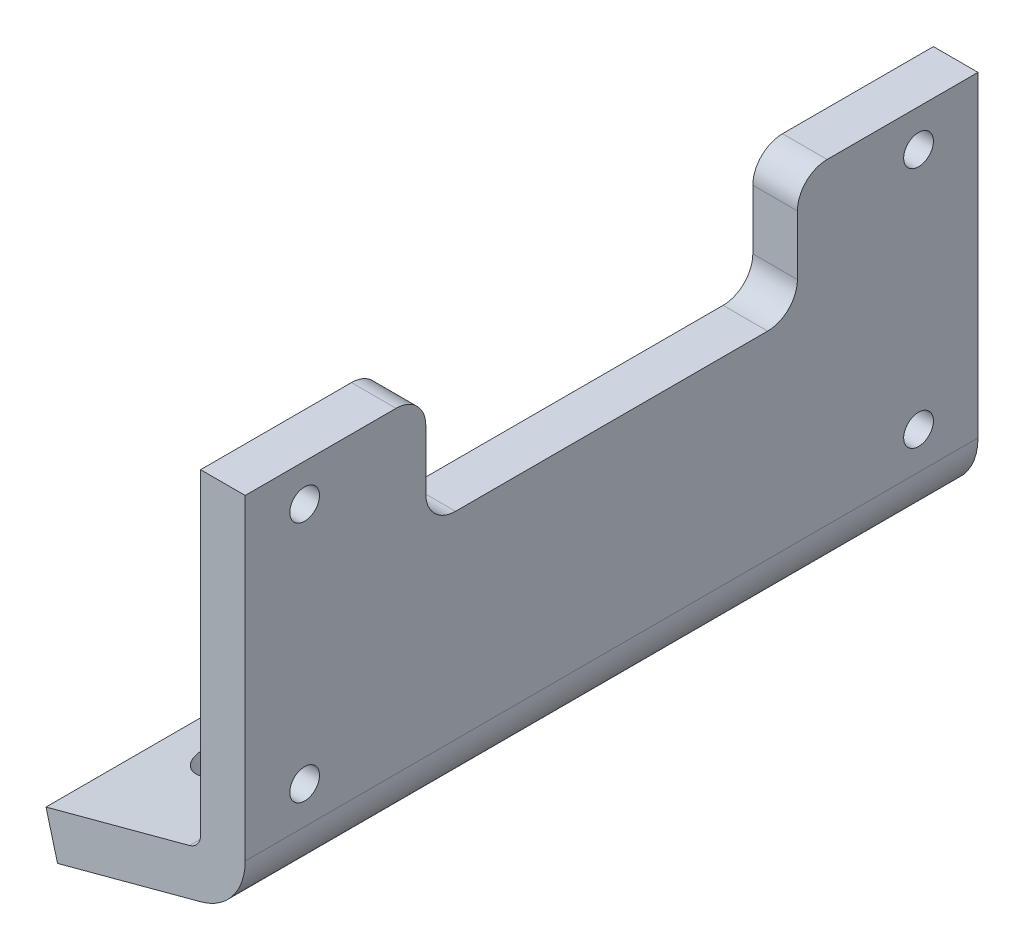
ISO-10303-21;
HEADER;
FILE_DESCRIPTION(('STEP AP214'),'2;1');
FILE_NAME('part.step','',(''),(''),'','','');
FILE_SCHEMA(('AUTOMOTIVE_DESIGN { 1 0 10303 214 1 1 1 1 }'));
ENDSEC;
DATA;
#1=APPLICATION_CONTEXT('core data for automotive mechanical design processes');
#2=APPLICATION_PROTOCOL_DEFINITION('international standard','automotive_design',2000,#1);
#3=PRODUCT_CONTEXT('',#1,'mechanical');
#4=PRODUCT('Part','Part','',(#3));
#5=PRODUCT_RELATED_PRODUCT_CATEGORY('part','',(#4));
#6=PRODUCT_DEFINITION_FORMATION('','',#4);
#7=PRODUCT_DEFINITION_CONTEXT('part definition',#1,'design');
#8=PRODUCT_DEFINITION('design','',#6,#7);
#9=PRODUCT_DEFINITION_SHAPE('','',#8);
#10=(LENGTH_UNIT() NAMED_UNIT(*) SI_UNIT(.MILLI.,.METRE.));
#11=(NAMED_UNIT(*) PLANE_ANGLE_UNIT() SI_UNIT($,.RADIAN.));
#12=(NAMED_UNIT(*) SI_UNIT($,.STERADIAN.) SOLID_ANGLE_UNIT());
#13=UNCERTAINTY_MEASURE_WITH_UNIT(LENGTH_MEASURE(1.E-05),#10,'distance_accuracy_value','');
#14=(GEOMETRIC_REPRESENTATION_CONTEXT(3) GLOBAL_UNCERTAINTY_ASSIGNED_CONTEXT((#13)) GLOBAL_UNIT_ASSIGNED_CONTEXT((#10,
#11,#12)) REPRESENTATION_CONTEXT('',''));
#15=CARTESIAN_POINT('',(0.,0.,0.));
#16=DIRECTION('',(0.,0.,1.));
#17=DIRECTION('',(1.,0.,0.));
#18=AXIS2_PLACEMENT_3D('',#15,#16,#17);
#19=CARTESIAN_POINT('',(-1.5,20.3,49.3));
#20=DIRECTION('',(0.,-1.,0.));
#21=DIRECTION('',(0.,0.,-1.));
#22=AXIS2_PLACEMENT_3D('',#19,#20,#21);
#23=PLANE('',#22);
#24=DIRECTION('',(0.,0.,-1.));
#25=VECTOR('',#24,1.);
#26=CARTESIAN_POINT('',(1.5,20.3,49.3));
#27=LINE('',#26,#25);
#28=CARTESIAN_POINT('',(1.5,20.3,49.3));
#29=VERTEX_POINT('',#28);
#30=CARTESIAN_POINT('',(1.5,20.3,39.15));
#31=VERTEX_POINT('',#30);
#32=EDGE_CURVE('E300',#29,#31,#27,.T.);
#33=ORIENTED_EDGE('',*,*,#32,.T.);
#34=DIRECTION('',(-1.,0.,0.));
#35=VECTOR('',#34,1.);
#36=CARTESIAN_POINT('',(-1.5,20.3,39.15));
#37=LINE('',#36,#35);
#38=CARTESIAN_POINT('',(-1.5,20.3,39.15));
#39=VERTEX_POINT('',#38);
#40=EDGE_CURVE('E209',#31,#39,#37,.T.);
#41=ORIENTED_EDGE('',*,*,#40,.T.);
#42=DIRECTION('',(0.,0.,-1.));
#43=VECTOR('',#42,1.);
#44=CARTESIAN_POINT('',(-1.5,20.3,49.3));
#45=LINE('',#44,#43);
#46=CARTESIAN_POINT('',(-1.5,20.3,49.3));
#47=VERTEX_POINT('',#46);
#48=EDGE_CURVE('E297',#47,#39,#45,.T.);
#49=ORIENTED_EDGE('',*,*,#48,.F.);
#50=DIRECTION('',(-1.,0.,0.));
#51=VECTOR('',#50,1.);
#52=CARTESIAN_POINT('',(-1.5,20.3,49.3));
#53=LINE('',#52,#51);
#54=EDGE_CURVE('E162',#29,#47,#53,.T.);
#55=ORIENTED_EDGE('',*,*,#54,.F.);
#56=EDGE_LOOP('',(#33,#41,#49,#55));
#57=FACE_BOUND('',#56,.T.);
#58=ADVANCED_FACE('F33',(#57),#23,.F.);
#59=CARTESIAN_POINT('',(-1.5,20.3,49.3));
#60=DIRECTION('',(1.,0.,0.));
#61=DIRECTION('',(0.,1.,0.));
#62=AXIS2_PLACEMENT_3D('',#59,#60,#61);
#63=PLANE('',#62);
#64=DIRECTION('',(0.,1.,0.));
#65=VECTOR('',#64,1.);
#66=CARTESIAN_POINT('',(-1.5,20.3,12.15));
#67=LINE('',#66,#65);
#68=CARTESIAN_POINT('',(-1.5,14.3,12.15));
#69=VERTEX_POINT('',#68);
#70=CARTESIAN_POINT('',(-1.5,18.3,12.15));
#71=VERTEX_POINT('',#70);
#72=EDGE_CURVE('E241',#69,#71,#67,.T.);
#73=ORIENTED_EDGE('',*,*,#72,.T.);
#74=CARTESIAN_POINT('',(-1.5,18.3,10.15));
#75=DIRECTION('',(1.,0.,0.));
#76=DIRECTION('',(0.,1.,0.));
#77=AXIS2_PLACEMENT_3D('',#74,#75,#76);
#78=CIRCLE('',#77,2.);
#79=CARTESIAN_POINT('',(-1.5,20.3,10.15));
#80=VERTEX_POINT('',#79);
#81=EDGE_CURVE('E199',#71,#80,#78,.F.);
#82=ORIENTED_EDGE('',*,*,#81,.T.);
#83=CARTESIAN_POINT('',(-1.5,20.3,0.));
#84=VERTEX_POINT('',#83);
#85=EDGE_CURVE('E280',#80,#84,#45,.T.);
#86=ORIENTED_EDGE('',*,*,#85,.T.);
#87=DIRECTION('',(0.,-1.,0.));
#88=VECTOR('',#87,1.);
#89=CARTESIAN_POINT('',(-1.5,20.3,0.));
#90=LINE('',#89,#88);
#91=CARTESIAN_POINT('',(-1.5,-1.,0.));
#92=VERTEX_POINT('',#91);
#93=EDGE_CURVE('E171',#84,#92,#90,.T.);
#94=ORIENTED_EDGE('',*,*,#93,.T.);
#95=DIRECTION('',(0.,0.,-1.));
#96=VECTOR('',#95,1.);
#97=CARTESIAN_POINT('',(-1.5,-1.,49.3));
#98=LINE('',#97,#96);
#99=CARTESIAN_POINT('',(-1.5,-1.,49.3));
#100=VERTEX_POINT('',#99);
#101=EDGE_CURVE('E150',#100,#92,#98,.T.);
#102=ORIENTED_EDGE('',*,*,#101,.F.);
#103=DIRECTION('',(0.,-1.,0.));
#104=VECTOR('',#103,1.);
#105=CARTESIAN_POINT('',(-1.5,20.3,49.3));
#106=LINE('',#105,#104);
#107=EDGE_CURVE('E157',#47,#100,#106,.T.);
#108=ORIENTED_EDGE('',*,*,#107,.F.);
#109=ORIENTED_EDGE('',*,*,#48,.T.);
#110=CARTESIAN_POINT('',(-1.5,18.3,39.15));
#111=DIRECTION('',(1.,0.,0.));
#112=DIRECTION('',(0.,1.,0.));
#113=AXIS2_PLACEMENT_3D('',#110,#111,#112);
#114=CIRCLE('',#113,2.);
#115=CARTESIAN_POINT('',(-1.5,18.3,37.15));
#116=VERTEX_POINT('',#115);
#117=EDGE_CURVE('E197',#39,#116,#114,.F.);
#118=ORIENTED_EDGE('',*,*,#117,.T.);
#119=DIRECTION('',(0.,-1.,0.));
#120=VECTOR('',#119,1.);
#121=CARTESIAN_POINT('',(-1.5,20.3,37.15));
#122=LINE('',#121,#120);
#123=CARTESIAN_POINT('',(-1.5,14.3,37.15));
#124=VERTEX_POINT('',#123);
#125=EDGE_CURVE('E237',#116,#124,#122,.T.);
#126=ORIENTED_EDGE('',*,*,#125,.T.);
#127=CARTESIAN_POINT('',(-1.5,14.3,35.15));
#128=DIRECTION('',(1.,0.,0.));
#129=DIRECTION('',(0.,1.,0.));
#130=AXIS2_PLACEMENT_3D('',#127,#128,#129);
#131=CIRCLE('',#130,2.);
#132=CARTESIAN_POINT('',(-1.5,12.3,35.15));
#133=VERTEX_POINT('',#132);
#134=EDGE_CURVE('E11',#124,#133,#131,.T.);
#135=ORIENTED_EDGE('',*,*,#134,.T.);
#136=DIRECTION('',(0.,0.,-1.));
#137=VECTOR('',#136,1.);
#138=CARTESIAN_POINT('',(-1.5,12.3,49.3));
#139=LINE('',#138,#137);
#140=CARTESIAN_POINT('',(-1.5,12.3,14.15));
#141=VERTEX_POINT('',#140);
#142=EDGE_CURVE('E234',#133,#141,#139,.T.);
#143=ORIENTED_EDGE('',*,*,#142,.T.);
#144=CARTESIAN_POINT('',(-1.5,14.3,14.15));
#145=DIRECTION('',(1.,0.,0.));
#146=DIRECTION('',(0.,1.,0.));
#147=AXIS2_PLACEMENT_3D('',#144,#145,#146);
#148=CIRCLE('',#147,2.);
#149=EDGE_CURVE('E214',#141,#69,#148,.T.);
#150=ORIENTED_EDGE('',*,*,#149,.T.);
#151=EDGE_LOOP('',(#73,#82,#86,#94,#102,#108,#109,#118,#126,#135,#143,#150));
#152=FACE_BOUND('',#151,.T.);
#153=CARTESIAN_POINT('',(-1.5,1.49999999999999,45.3));
#154=DIRECTION('',(1.,0.,0.));
#155=DIRECTION('',(0.,1.,0.));
#156=AXIS2_PLACEMENT_3D('',#153,#154,#155);
#157=CIRCLE('',#156,0.999999999999998);
#158=CARTESIAN_POINT('',(-1.5,2.49999999999999,45.3));
#159=VERTEX_POINT('',#158);
#160=EDGE_CURVE('E267',#159,#159,#157,.T.);
#161=ORIENTED_EDGE('',*,*,#160,.T.);
#162=EDGE_LOOP('',(#161));
#163=FACE_BOUND('',#162,.T.);
#164=CARTESIAN_POINT('',(-1.5,1.5,4.));
#165=DIRECTION('',(1.,0.,0.));
#166=DIRECTION('',(0.,1.,0.));
#167=AXIS2_PLACEMENT_3D('',#164,#165,#166);
#168=CIRCLE('',#167,1.);
#169=CARTESIAN_POINT('',(-1.5,2.5,4.));
#170=VERTEX_POINT('',#169);
#171=EDGE_CURVE('E264',#170,#170,#168,.T.);
#172=ORIENTED_EDGE('',*,*,#171,.T.);
#173=EDGE_LOOP('',(#172));
#174=FACE_BOUND('',#173,.T.);
#175=CARTESIAN_POINT('',(-1.5,17.8,4.));
#176=DIRECTION('',(1.,0.,0.));
#177=DIRECTION('',(0.,1.,0.));
#178=AXIS2_PLACEMENT_3D('',#175,#176,#177);
#179=CIRCLE('',#178,1.);
#180=CARTESIAN_POINT('',(-1.5,18.8,4.));
#181=VERTEX_POINT('',#180);
#182=EDGE_CURVE('E261',#181,#181,#179,.T.);
#183=ORIENTED_EDGE('',*,*,#182,.T.);
#184=EDGE_LOOP('',(#183));
#185=FACE_BOUND('',#184,.T.);
#186=CARTESIAN_POINT('',(-1.5,17.8,45.3));
#187=DIRECTION('',(1.,0.,0.));
#188=DIRECTION('',(0.,1.,0.));
#189=AXIS2_PLACEMENT_3D('',#186,#187,#188);
#190=CIRCLE('',#189,0.999999999999998);
#191=CARTESIAN_POINT('',(-1.5,18.8,45.3));
#192=VERTEX_POINT('',#191);
#193=EDGE_CURVE('E258',#192,#192,#190,.T.);
#194=ORIENTED_EDGE('',*,*,#193,.T.);
#195=EDGE_LOOP('',(#194));
#196=FACE_BOUND('',#195,.T.);
#197=ADVANCED_FACE('F168',(#152,#163,#174,#185,#196),#63,.F.);
#198=CARTESIAN_POINT('',(-2.5,-1.,49.3));
#199=DIRECTION('',(0.,0.,-1.));
#200=DIRECTION('',(-1.,0.,0.));
#201=AXIS2_PLACEMENT_3D('',#198,#199,#200);
#202=CYLINDRICAL_SURFACE('',#201,1.);
#203=CARTESIAN_POINT('',(-2.5,-1.,0.));
#204=DIRECTION('',(0.,0.,-1.));
#205=DIRECTION('',(-1.,0.,0.));
#206=AXIS2_PLACEMENT_3D('',#203,#204,#205);
#207=CIRCLE('',#206,1.);
#208=CARTESIAN_POINT('',(-2.24118095489748,-1.96592582628907,0.));
#209=VERTEX_POINT('',#208);
#210=EDGE_CURVE('E282',#92,#209,#207,.T.);
#211=ORIENTED_EDGE('',*,*,#210,.T.);
#212=DIRECTION('',(0.,0.,-1.));
#213=VECTOR('',#212,1.);
#214=CARTESIAN_POINT('',(-2.24118095489748,-1.96592582628907,49.3));
#215=LINE('',#214,#213);
#216=CARTESIAN_POINT('',(-2.24118095489748,-1.96592582628907,49.3));
#217=VERTEX_POINT('',#216);
#218=EDGE_CURVE('E153',#217,#209,#215,.T.);
#219=ORIENTED_EDGE('',*,*,#218,.F.);
#220=CARTESIAN_POINT('',(-2.5,-1.,49.3));
#221=DIRECTION('',(0.,0.,-1.));
#222=DIRECTION('',(-1.,0.,0.));
#223=AXIS2_PLACEMENT_3D('',#220,#221,#222);
#224=CIRCLE('',#223,1.);
#225=EDGE_CURVE('E146',#100,#217,#224,.T.);
#226=ORIENTED_EDGE('',*,*,#225,.F.);
#227=ORIENTED_EDGE('',*,*,#101,.T.);
#228=EDGE_LOOP('',(#211,#219,#226,#227));
#229=FACE_BOUND('',#228,.T.);
#230=ADVANCED_FACE('F148',(#229),#202,.F.);
#231=CARTESIAN_POINT('',(-2.24118095489748,-1.96592582628907,49.3));
#232=DIRECTION('',(0.258819045102515,-0.96592582628907,0.));
#233=DIRECTION('',(0.96592582628907,0.258819045102515,0.));
#234=AXIS2_PLACEMENT_3D('',#231,#232,#233);
#235=PLANE('',#234);
#236=CARTESIAN_POINT('',(-7.07081008634283,-3.26002105180165,8.));
#237=DIRECTION('',(-0.258819045102515,0.96592582628907,0.));
#238=DIRECTION('',(-0.96592582628907,-0.258819045102515,0.));
#239=AXIS2_PLACEMENT_3D('',#236,#237,#238);
#240=CIRCLE('',#239,2.25);
#241=CARTESIAN_POINT('',(-9.24414319549324,-3.84236390328231,8.));
#242=VERTEX_POINT('',#241);
#243=EDGE_CURVE('E185',#242,#242,#240,.T.);
#244=ORIENTED_EDGE('',*,*,#243,.F.);
#245=EDGE_LOOP('',(#244));
#246=FACE_BOUND('',#245,.T.);
#247=CARTESIAN_POINT('',(-7.07081008634283,-3.26002105180165,41.3));
#248=DIRECTION('',(-0.258819045102515,0.96592582628907,0.));
#249=DIRECTION('',(-0.96592582628907,-0.258819045102515,0.));
#250=AXIS2_PLACEMENT_3D('',#247,#248,#249);
#251=CIRCLE('',#250,2.25);
#252=CARTESIAN_POINT('',(-9.24414319549324,-3.84236390328231,41.3));
#253=VERTEX_POINT('',#252);
#254=EDGE_CURVE('E236',#253,#253,#251,.T.);
#255=ORIENTED_EDGE('',*,*,#254,.F.);
#256=EDGE_LOOP('',(#255));
#257=FACE_BOUND('',#256,.T.);
#258=DIRECTION('',(-0.96592582628907,-0.258819045102515,0.));
#259=VECTOR('',#258,1.);
#260=CARTESIAN_POINT('',(-2.24118095489748,-1.96592582628907,0.));
#261=LINE('',#260,#259);
#262=CARTESIAN_POINT('',(-11.9004392177882,-4.55411627731422,0.));
#263=VERTEX_POINT('',#262);
#264=EDGE_CURVE('E284',#209,#263,#261,.T.);
#265=ORIENTED_EDGE('',*,*,#264,.T.);
#266=DIRECTION('',(0.,0.,-1.));
#267=VECTOR('',#266,1.);
#268=CARTESIAN_POINT('',(-11.9004392177882,-4.55411627731422,49.3));
#269=LINE('',#268,#267);
#270=CARTESIAN_POINT('',(-11.9004392177882,-4.55411627731422,49.3));
#271=VERTEX_POINT('',#270);
#272=EDGE_CURVE('E177',#271,#263,#269,.T.);
#273=ORIENTED_EDGE('',*,*,#272,.F.);
#274=DIRECTION('',(-0.96592582628907,-0.258819045102515,0.));
#275=VECTOR('',#274,1.);
#276=CARTESIAN_POINT('',(-2.24118095489748,-1.96592582628907,49.3));
#277=LINE('',#276,#275);
#278=EDGE_CURVE('E156',#217,#271,#277,.T.);
#279=ORIENTED_EDGE('',*,*,#278,.F.);
#280=ORIENTED_EDGE('',*,*,#218,.T.);
#281=EDGE_LOOP('',(#265,#273,#279,#280));
#282=FACE_BOUND('',#281,.T.);
#283=ADVANCED_FACE('F335',(#246,#257,#282),#235,.F.);
#284=CARTESIAN_POINT('',(-11.9004392177882,-4.55411627731422,49.3));
#285=DIRECTION('',(0.96592582628907,0.258819045102515,0.));
#286=DIRECTION('',(-0.258819045102515,0.96592582628907,0.));
#287=AXIS2_PLACEMENT_3D('',#284,#285,#286);
#288=PLANE('',#287);
#289=DIRECTION('',(0.258819045102515,-0.96592582628907,0.));
#290=VECTOR('',#289,1.);
#291=CARTESIAN_POINT('',(-11.9004392177882,-4.55411627731422,0.));
#292=LINE('',#291,#290);
#293=CARTESIAN_POINT('',(-11.1239820824806,-7.45189375618143,0.));
#294=VERTEX_POINT('',#293);
#295=EDGE_CURVE('E286',#263,#294,#292,.T.);
#296=ORIENTED_EDGE('',*,*,#295,.T.);
#297=DIRECTION('',(0.,0.,-1.));
#298=VECTOR('',#297,1.);
#299=CARTESIAN_POINT('',(-11.1239820824806,-7.45189375618143,49.3));
#300=LINE('',#299,#298);
#301=CARTESIAN_POINT('',(-11.1239820824806,-7.45189375618143,49.3));
#302=VERTEX_POINT('',#301);
#303=EDGE_CURVE('E309',#302,#294,#300,.T.);
#304=ORIENTED_EDGE('',*,*,#303,.F.);
#305=DIRECTION('',(0.258819045102515,-0.96592582628907,0.));
#306=VECTOR('',#305,1.);
#307=CARTESIAN_POINT('',(-11.9004392177882,-4.55411627731422,49.3));
#308=LINE('',#307,#306);
#309=EDGE_CURVE('E271',#271,#302,#308,.T.);
#310=ORIENTED_EDGE('',*,*,#309,.F.);
#311=ORIENTED_EDGE('',*,*,#272,.T.);
#312=EDGE_LOOP('',(#296,#304,#310,#311));
#313=FACE_BOUND('',#312,.T.);
#314=ADVANCED_FACE('F316',(#313),#288,.F.);
#315=CARTESIAN_POINT('',(-11.1239820824806,-7.45189375618143,49.3));
#316=DIRECTION('',(-0.258819045102515,0.96592582628907,0.));
#317=DIRECTION('',(-0.96592582628907,-0.258819045102515,0.));
#318=AXIS2_PLACEMENT_3D('',#315,#316,#317);
#319=PLANE('',#318);
#320=CARTESIAN_POINT('',(-6.29435295103529,-6.15779853066886,8.));
#321=DIRECTION('',(-0.258819045102515,0.96592582628907,0.));
#322=DIRECTION('',(-0.96592582628907,-0.258819045102515,0.));
#323=AXIS2_PLACEMENT_3D('',#320,#321,#322);
#324=CIRCLE('',#323,2.25);
#325=CARTESIAN_POINT('',(-8.4676860601857,-6.74014138214952,8.));
#326=VERTEX_POINT('',#325);
#327=EDGE_CURVE('E184',#326,#326,#324,.T.);
#328=ORIENTED_EDGE('',*,*,#327,.T.);
#329=EDGE_LOOP('',(#328));
#330=FACE_BOUND('',#329,.T.);
#331=CARTESIAN_POINT('',(-6.29435295103529,-6.15779853066886,41.3));
#332=DIRECTION('',(-0.258819045102515,0.96592582628907,0.));
#333=DIRECTION('',(-0.96592582628907,-0.258819045102515,0.));
#334=AXIS2_PLACEMENT_3D('',#331,#332,#333);
#335=CIRCLE('',#334,2.25);
#336=CARTESIAN_POINT('',(-8.4676860601857,-6.74014138214952,41.3));
#337=VERTEX_POINT('',#336);
#338=EDGE_CURVE('E181',#337,#337,#335,.T.);
#339=ORIENTED_EDGE('',*,*,#338,.T.);
#340=EDGE_LOOP('',(#339));
#341=FACE_BOUND('',#340,.T.);
#342=DIRECTION('',(0.96592582628907,0.258819045102515,0.));
#343=VECTOR('',#342,1.);
#344=CARTESIAN_POINT('',(-11.1239820824806,-7.45189375618143,0.));
#345=LINE('',#344,#343);
#346=CARTESIAN_POINT('',(-1.46472381958994,-4.86370330515628,0.));
#347=VERTEX_POINT('',#346);
#348=EDGE_CURVE('E288',#294,#347,#345,.T.);
#349=ORIENTED_EDGE('',*,*,#348,.T.);
#350=DIRECTION('',(0.,0.,-1.));
#351=VECTOR('',#350,1.);
#352=CARTESIAN_POINT('',(-1.46472381958994,-4.86370330515628,49.3));
#353=LINE('',#352,#351);
#354=CARTESIAN_POINT('',(-1.46472381958994,-4.86370330515628,49.3));
#355=VERTEX_POINT('',#354);
#356=EDGE_CURVE('E306',#355,#347,#353,.T.);
#357=ORIENTED_EDGE('',*,*,#356,.F.);
#358=DIRECTION('',(0.96592582628907,0.258819045102515,0.));
#359=VECTOR('',#358,1.);
#360=CARTESIAN_POINT('',(-11.1239820824806,-7.45189375618143,49.3));
#361=LINE('',#360,#359);
#362=EDGE_CURVE('E273',#302,#355,#361,.T.);
#363=ORIENTED_EDGE('',*,*,#362,.F.);
#364=ORIENTED_EDGE('',*,*,#303,.T.);
#365=EDGE_LOOP('',(#349,#357,#363,#364));
#366=FACE_BOUND('',#365,.T.);
#367=ADVANCED_FACE('F327',(#330,#341,#366),#319,.F.);
#368=CARTESIAN_POINT('',(-2.5,-1.,49.3));
#369=DIRECTION('',(0.,0.,-1.));
#370=DIRECTION('',(-1.,0.,0.));
#371=AXIS2_PLACEMENT_3D('',#368,#369,#370);
#372=CYLINDRICAL_SURFACE('',#371,4.);
#373=CARTESIAN_POINT('',(-2.5,-1.,0.));
#374=DIRECTION('',(0.,0.,1.));
#375=DIRECTION('',(-1.,0.,0.));
#376=AXIS2_PLACEMENT_3D('',#373,#374,#375);
#377=CIRCLE('',#376,4.);
#378=CARTESIAN_POINT('',(1.5,-1.,0.));
#379=VERTEX_POINT('',#378);
#380=EDGE_CURVE('E290',#347,#379,#377,.T.);
#381=ORIENTED_EDGE('',*,*,#380,.T.);
#382=DIRECTION('',(0.,0.,-1.));
#383=VECTOR('',#382,1.);
#384=CARTESIAN_POINT('',(1.5,-1.,49.3));
#385=LINE('',#384,#383);
#386=CARTESIAN_POINT('',(1.5,-1.,49.3));
#387=VERTEX_POINT('',#386);
#388=EDGE_CURVE('E303',#387,#379,#385,.T.);
#389=ORIENTED_EDGE('',*,*,#388,.F.);
#390=CARTESIAN_POINT('',(-2.5,-1.,49.3));
#391=DIRECTION('',(0.,0.,1.));
#392=DIRECTION('',(-1.,0.,0.));
#393=AXIS2_PLACEMENT_3D('',#390,#391,#392);
#394=CIRCLE('',#393,4.);
#395=EDGE_CURVE('E275',#355,#387,#394,.T.);
#396=ORIENTED_EDGE('',*,*,#395,.F.);
#397=ORIENTED_EDGE('',*,*,#356,.T.);
#398=EDGE_LOOP('',(#381,#389,#396,#397));
#399=FACE_BOUND('',#398,.T.);
#400=ADVANCED_FACE('F331',(#399),#372,.T.);
#401=CARTESIAN_POINT('',(1.5,20.3,49.3));
#402=DIRECTION('',(-1.,0.,0.));
#403=DIRECTION('',(0.,-1.,0.));
#404=AXIS2_PLACEMENT_3D('',#401,#402,#403);
#405=PLANE('',#404);
#406=CARTESIAN_POINT('',(1.5,1.49999999999999,45.3));
#407=DIRECTION('',(1.,0.,0.));
#408=DIRECTION('',(0.,1.,0.));
#409=AXIS2_PLACEMENT_3D('',#406,#407,#408);
#410=CIRCLE('',#409,0.999999999999998);
#411=CARTESIAN_POINT('',(1.5,2.49999999999999,45.3));
#412=VERTEX_POINT('',#411);
#413=EDGE_CURVE('E187',#412,#412,#410,.T.);
#414=ORIENTED_EDGE('',*,*,#413,.F.);
#415=EDGE_LOOP('',(#414));
#416=FACE_BOUND('',#415,.T.);
#417=CARTESIAN_POINT('',(1.5,1.5,4.));
#418=DIRECTION('',(1.,0.,0.));
#419=DIRECTION('',(0.,1.,0.));
#420=AXIS2_PLACEMENT_3D('',#417,#418,#419);
#421=CIRCLE('',#420,1.);
#422=CARTESIAN_POINT('',(1.5,2.5,4.));
#423=VERTEX_POINT('',#422);
#424=EDGE_CURVE('E251',#423,#423,#421,.T.);
#425=ORIENTED_EDGE('',*,*,#424,.F.);
#426=EDGE_LOOP('',(#425));
#427=FACE_BOUND('',#426,.T.);
#428=CARTESIAN_POINT('',(1.5,17.8,4.));
#429=DIRECTION('',(1.,0.,0.));
#430=DIRECTION('',(0.,1.,0.));
#431=AXIS2_PLACEMENT_3D('',#428,#429,#430);
#432=CIRCLE('',#431,1.);
#433=CARTESIAN_POINT('',(1.5,18.8,4.));
#434=VERTEX_POINT('',#433);
#435=EDGE_CURVE('E247',#434,#434,#432,.T.);
#436=ORIENTED_EDGE('',*,*,#435,.F.);
#437=EDGE_LOOP('',(#436));
#438=FACE_BOUND('',#437,.T.);
#439=CARTESIAN_POINT('',(1.5,17.8,45.3));
#440=DIRECTION('',(1.,0.,0.));
#441=DIRECTION('',(0.,1.,0.));
#442=AXIS2_PLACEMENT_3D('',#439,#440,#441);
#443=CIRCLE('',#442,0.999999999999998);
#444=CARTESIAN_POINT('',(1.5,18.8,45.3));
#445=VERTEX_POINT('',#444);
#446=EDGE_CURVE('E250',#445,#445,#443,.T.);
#447=ORIENTED_EDGE('',*,*,#446,.F.);
#448=EDGE_LOOP('',(#447));
#449=FACE_BOUND('',#448,.T.);
#450=CARTESIAN_POINT('',(1.5,20.3,10.15));
#451=VERTEX_POINT('',#450);
#452=CARTESIAN_POINT('',(1.5,20.3,0.));
#453=VERTEX_POINT('',#452);
#454=EDGE_CURVE('E299',#451,#453,#27,.T.);
#455=ORIENTED_EDGE('',*,*,#454,.F.);
#456=CARTESIAN_POINT('',(1.5,18.3,10.15));
#457=DIRECTION('',(-1.,0.,0.));
#458=DIRECTION('',(0.,-1.,0.));
#459=AXIS2_PLACEMENT_3D('',#456,#457,#458);
#460=CIRCLE('',#459,2.);
#461=CARTESIAN_POINT('',(1.5,18.3,12.15));
#462=VERTEX_POINT('',#461);
#463=EDGE_CURVE('E190',#451,#462,#460,.F.);
#464=ORIENTED_EDGE('',*,*,#463,.T.);
#465=DIRECTION('',(0.,1.,0.));
#466=VECTOR('',#465,1.);
#467=CARTESIAN_POINT('',(1.5,20.3,12.15));
#468=LINE('',#467,#466);
#469=CARTESIAN_POINT('',(1.5,14.3,12.15));
#470=VERTEX_POINT('',#469);
#471=EDGE_CURVE('E374',#470,#462,#468,.T.);
#472=ORIENTED_EDGE('',*,*,#471,.F.);
#473=CARTESIAN_POINT('',(1.5,14.3,14.15));
#474=DIRECTION('',(-1.,0.,0.));
#475=DIRECTION('',(0.,-1.,0.));
#476=AXIS2_PLACEMENT_3D('',#473,#474,#475);
#477=CIRCLE('',#476,2.);
#478=CARTESIAN_POINT('',(1.5,12.3,14.15));
#479=VERTEX_POINT('',#478);
#480=EDGE_CURVE('E212',#470,#479,#477,.T.);
#481=ORIENTED_EDGE('',*,*,#480,.T.);
#482=DIRECTION('',(0.,0.,-1.));
#483=VECTOR('',#482,1.);
#484=CARTESIAN_POINT('',(1.5,12.3,37.15));
#485=LINE('',#484,#483);
#486=CARTESIAN_POINT('',(1.5,12.3,35.15));
#487=VERTEX_POINT('',#486);
#488=EDGE_CURVE('E223',#487,#479,#485,.T.);
#489=ORIENTED_EDGE('',*,*,#488,.F.);
#490=CARTESIAN_POINT('',(1.5,14.3,35.15));
#491=DIRECTION('',(-1.,0.,0.));
#492=DIRECTION('',(0.,-1.,0.));
#493=AXIS2_PLACEMENT_3D('',#490,#491,#492);
#494=CIRCLE('',#493,2.);
#495=CARTESIAN_POINT('',(1.5,14.3,37.15));
#496=VERTEX_POINT('',#495);
#497=EDGE_CURVE('E41',#487,#496,#494,.T.);
#498=ORIENTED_EDGE('',*,*,#497,.T.);
#499=DIRECTION('',(0.,-1.,0.));
#500=VECTOR('',#499,1.);
#501=CARTESIAN_POINT('',(1.5,20.3,37.15));
#502=LINE('',#501,#500);
#503=CARTESIAN_POINT('',(1.5,18.3,37.15));
#504=VERTEX_POINT('',#503);
#505=EDGE_CURVE('E221',#504,#496,#502,.T.);
#506=ORIENTED_EDGE('',*,*,#505,.F.);
#507=CARTESIAN_POINT('',(1.5,18.3,39.15));
#508=DIRECTION('',(-1.,0.,0.));
#509=DIRECTION('',(0.,-1.,0.));
#510=AXIS2_PLACEMENT_3D('',#507,#508,#509);
#511=CIRCLE('',#510,2.);
#512=EDGE_CURVE('E175',#504,#31,#511,.F.);
#513=ORIENTED_EDGE('',*,*,#512,.T.);
#514=ORIENTED_EDGE('',*,*,#32,.F.);
#515=DIRECTION('',(0.,1.,0.));
#516=VECTOR('',#515,1.);
#517=CARTESIAN_POINT('',(1.5,20.3,49.3));
#518=LINE('',#517,#516);
#519=EDGE_CURVE('E277',#387,#29,#518,.T.);
#520=ORIENTED_EDGE('',*,*,#519,.F.);
#521=ORIENTED_EDGE('',*,*,#388,.T.);
#522=DIRECTION('',(0.,1.,0.));
#523=VECTOR('',#522,1.);
#524=CARTESIAN_POINT('',(1.5,20.3,0.));
#525=LINE('',#524,#523);
#526=EDGE_CURVE('E292',#379,#453,#525,.T.);
#527=ORIENTED_EDGE('',*,*,#526,.T.);
#528=EDGE_LOOP('',(#455,#464,#472,#481,#489,#498,#506,#513,#514,#520,#521,#527));
#529=FACE_BOUND('',#528,.T.);
#530=ADVANCED_FACE('F220',(#416,#427,#438,#449,#529),#405,.F.);
#531=ORIENTED_EDGE('',*,*,#85,.F.);
#532=DIRECTION('',(1.,0.,0.));
#533=VECTOR('',#532,1.);
#534=CARTESIAN_POINT('',(-1.5,20.3,10.15));
#535=LINE('',#534,#533);
#536=EDGE_CURVE('E172',#80,#451,#535,.T.);
#537=ORIENTED_EDGE('',*,*,#536,.T.);
#538=ORIENTED_EDGE('',*,*,#454,.T.);
#539=DIRECTION('',(-1.,0.,0.));
#540=VECTOR('',#539,1.);
#541=CARTESIAN_POINT('',(-1.5,20.3,0.));
#542=LINE('',#541,#540);
#543=EDGE_CURVE('E165',#453,#84,#542,.T.);
#544=ORIENTED_EDGE('',*,*,#543,.T.);
#545=EDGE_LOOP('',(#531,#537,#538,#544));
#546=FACE_BOUND('',#545,.T.);
#547=ADVANCED_FACE('F350',(#546),#23,.F.);
#548=CARTESIAN_POINT('',(-2.5,-1.,49.3));
#549=DIRECTION('',(0.,0.,-1.));
#550=DIRECTION('',(-1.,0.,0.));
#551=AXIS2_PLACEMENT_3D('',#548,#549,#550);
#552=PLANE('',#551);
#553=ORIENTED_EDGE('',*,*,#107,.T.);
#554=ORIENTED_EDGE('',*,*,#225,.T.);
#555=ORIENTED_EDGE('',*,*,#278,.T.);
#556=ORIENTED_EDGE('',*,*,#309,.T.);
#557=ORIENTED_EDGE('',*,*,#362,.T.);
#558=ORIENTED_EDGE('',*,*,#395,.T.);
#559=ORIENTED_EDGE('',*,*,#519,.T.);
#560=ORIENTED_EDGE('',*,*,#54,.T.);
#561=EDGE_LOOP('',(#553,#554,#555,#556,#557,#558,#559,#560));
#562=FACE_BOUND('',#561,.T.);
#563=ADVANCED_FACE('F160',(#562),#552,.F.);
#564=CARTESIAN_POINT('',(-2.5,-1.,0.));
#565=DIRECTION('',(0.,0.,-1.));
#566=DIRECTION('',(-1.,0.,0.));
#567=AXIS2_PLACEMENT_3D('',#564,#565,#566);
#568=PLANE('',#567);
#569=ORIENTED_EDGE('',*,*,#93,.F.);
#570=ORIENTED_EDGE('',*,*,#543,.F.);
#571=ORIENTED_EDGE('',*,*,#526,.F.);
#572=ORIENTED_EDGE('',*,*,#380,.F.);
#573=ORIENTED_EDGE('',*,*,#348,.F.);
#574=ORIENTED_EDGE('',*,*,#295,.F.);
#575=ORIENTED_EDGE('',*,*,#264,.F.);
#576=ORIENTED_EDGE('',*,*,#210,.F.);
#577=EDGE_LOOP('',(#569,#570,#571,#572,#573,#574,#575,#576));
#578=FACE_BOUND('',#577,.T.);
#579=ADVANCED_FACE('F322',(#578),#568,.T.);
#580=CARTESIAN_POINT('',(-11.9004392177882,17.8,45.3));
#581=DIRECTION('',(1.,0.,0.));
#582=DIRECTION('',(0.,1.,0.));
#583=AXIS2_PLACEMENT_3D('',#580,#581,#582);
#584=CYLINDRICAL_SURFACE('',#583,0.999999999999998);
#585=ORIENTED_EDGE('',*,*,#446,.T.);
#586=EDGE_LOOP('',(#585));
#587=FACE_BOUND('',#586,.T.);
#588=ORIENTED_EDGE('',*,*,#193,.F.);
#589=EDGE_LOOP('',(#588));
#590=FACE_BOUND('',#589,.T.);
#591=ADVANCED_FACE('F414',(#587,#590),#584,.F.);
#592=CARTESIAN_POINT('',(-11.9004392177882,17.8,4.));
#593=DIRECTION('',(1.,0.,0.));
#594=DIRECTION('',(0.,1.,0.));
#595=AXIS2_PLACEMENT_3D('',#592,#593,#594);
#596=CYLINDRICAL_SURFACE('',#595,1.);
#597=ORIENTED_EDGE('',*,*,#435,.T.);
#598=EDGE_LOOP('',(#597));
#599=FACE_BOUND('',#598,.T.);
#600=ORIENTED_EDGE('',*,*,#182,.F.);
#601=EDGE_LOOP('',(#600));
#602=FACE_BOUND('',#601,.T.);
#603=ADVANCED_FACE('F410',(#599,#602),#596,.F.);
#604=CARTESIAN_POINT('',(-11.9004392177882,1.5,4.));
#605=DIRECTION('',(1.,0.,0.));
#606=DIRECTION('',(0.,1.,0.));
#607=AXIS2_PLACEMENT_3D('',#604,#605,#606);
#608=CYLINDRICAL_SURFACE('',#607,1.);
#609=ORIENTED_EDGE('',*,*,#424,.T.);
#610=EDGE_LOOP('',(#609));
#611=FACE_BOUND('',#610,.T.);
#612=ORIENTED_EDGE('',*,*,#171,.F.);
#613=EDGE_LOOP('',(#612));
#614=FACE_BOUND('',#613,.T.);
#615=ADVANCED_FACE('F413',(#611,#614),#608,.F.);
#616=CARTESIAN_POINT('',(-11.9004392177882,1.49999999999999,45.3));
#617=DIRECTION('',(1.,0.,0.));
#618=DIRECTION('',(0.,1.,0.));
#619=AXIS2_PLACEMENT_3D('',#616,#617,#618);
#620=CYLINDRICAL_SURFACE('',#619,0.999999999999998);
#621=ORIENTED_EDGE('',*,*,#413,.T.);
#622=EDGE_LOOP('',(#621));
#623=FACE_BOUND('',#622,.T.);
#624=ORIENTED_EDGE('',*,*,#160,.F.);
#625=EDGE_LOOP('',(#624));
#626=FACE_BOUND('',#625,.T.);
#627=ADVANCED_FACE('F408',(#623,#626),#620,.F.);
#628=CARTESIAN_POINT('',(-5.44870649996892,-9.31379405128895,41.3));
#629=DIRECTION('',(-0.258819045102515,0.96592582628907,0.));
#630=DIRECTION('',(-0.96592582628907,-0.258819045102515,0.));
#631=AXIS2_PLACEMENT_3D('',#628,#629,#630);
#632=CYLINDRICAL_SURFACE('',#631,2.25);
#633=ORIENTED_EDGE('',*,*,#254,.T.);
#634=EDGE_LOOP('',(#633));
#635=FACE_BOUND('',#634,.T.);
#636=ORIENTED_EDGE('',*,*,#338,.F.);
#637=EDGE_LOOP('',(#636));
#638=FACE_BOUND('',#637,.T.);
#639=ADVANCED_FACE('F404',(#635,#638),#632,.F.);
#640=CARTESIAN_POINT('',(-5.44870649996892,-9.31379405128895,8.));
#641=DIRECTION('',(-0.258819045102515,0.96592582628907,0.));
#642=DIRECTION('',(-0.96592582628907,-0.258819045102515,0.));
#643=AXIS2_PLACEMENT_3D('',#640,#641,#642);
#644=CYLINDRICAL_SURFACE('',#643,2.25);
#645=ORIENTED_EDGE('',*,*,#243,.T.);
#646=EDGE_LOOP('',(#645));
#647=FACE_BOUND('',#646,.T.);
#648=ORIENTED_EDGE('',*,*,#327,.F.);
#649=EDGE_LOOP('',(#648));
#650=FACE_BOUND('',#649,.T.);
#651=ADVANCED_FACE('F400',(#647,#650),#644,.F.);
#652=CARTESIAN_POINT('',(-11.9004392177882,12.3,37.15));
#653=DIRECTION('',(0.,-1.,0.));
#654=DIRECTION('',(0.,0.,-1.));
#655=AXIS2_PLACEMENT_3D('',#652,#653,#654);
#656=PLANE('',#655);
#657=ORIENTED_EDGE('',*,*,#488,.T.);
#658=DIRECTION('',(1.,0.,0.));
#659=VECTOR('',#658,1.);
#660=CARTESIAN_POINT('',(-1.5,12.3,14.15));
#661=LINE('',#660,#659);
#662=EDGE_CURVE('E48',#479,#141,#661,.F.);
#663=ORIENTED_EDGE('',*,*,#662,.T.);
#664=ORIENTED_EDGE('',*,*,#142,.F.);
#665=DIRECTION('',(1.,0.,0.));
#666=VECTOR('',#665,1.);
#667=CARTESIAN_POINT('',(1.5,12.3,35.15));
#668=LINE('',#667,#666);
#669=EDGE_CURVE('E201',#133,#487,#668,.T.);
#670=ORIENTED_EDGE('',*,*,#669,.T.);
#671=EDGE_LOOP('',(#657,#663,#664,#670));
#672=FACE_BOUND('',#671,.T.);
#673=ADVANCED_FACE('F233',(#672),#656,.F.);
#674=CARTESIAN_POINT('',(-11.9004392177882,20.3,37.15));
#675=DIRECTION('',(0.,0.,1.));
#676=DIRECTION('',(1.,0.,0.));
#677=AXIS2_PLACEMENT_3D('',#674,#675,#676);
#678=PLANE('',#677);
#679=ORIENTED_EDGE('',*,*,#505,.T.);
#680=DIRECTION('',(1.,0.,0.));
#681=VECTOR('',#680,1.);
#682=CARTESIAN_POINT('',(-1.5,14.3,37.15));
#683=LINE('',#682,#681);
#684=EDGE_CURVE('E207',#496,#124,#683,.F.);
#685=ORIENTED_EDGE('',*,*,#684,.T.);
#686=ORIENTED_EDGE('',*,*,#125,.F.);
#687=DIRECTION('',(-1.,0.,0.));
#688=VECTOR('',#687,1.);
#689=CARTESIAN_POINT('',(-11.9004392177882,18.3,37.15));
#690=LINE('',#689,#688);
#691=EDGE_CURVE('E205',#116,#504,#690,.F.);
#692=ORIENTED_EDGE('',*,*,#691,.T.);
#693=EDGE_LOOP('',(#679,#685,#686,#692));
#694=FACE_BOUND('',#693,.T.);
#695=ADVANCED_FACE('F228',(#694),#678,.F.);
#696=CARTESIAN_POINT('',(-11.9004392177882,20.3,12.15));
#697=DIRECTION('',(0.,0.,-1.));
#698=DIRECTION('',(0.,1.,0.));
#699=AXIS2_PLACEMENT_3D('',#696,#697,#698);
#700=PLANE('',#699);
#701=ORIENTED_EDGE('',*,*,#471,.T.);
#702=DIRECTION('',(1.,0.,0.));
#703=VECTOR('',#702,1.);
#704=CARTESIAN_POINT('',(-11.9004392177882,18.3,12.15));
#705=LINE('',#704,#703);
#706=EDGE_CURVE('E195',#462,#71,#705,.F.);
#707=ORIENTED_EDGE('',*,*,#706,.T.);
#708=ORIENTED_EDGE('',*,*,#72,.F.);
#709=DIRECTION('',(1.,0.,0.));
#710=VECTOR('',#709,1.);
#711=CARTESIAN_POINT('',(1.5,14.3,12.15));
#712=LINE('',#711,#710);
#713=EDGE_CURVE('E192',#69,#470,#712,.T.);
#714=ORIENTED_EDGE('',*,*,#713,.T.);
#715=EDGE_LOOP('',(#701,#707,#708,#714));
#716=FACE_BOUND('',#715,.T.);
#717=ADVANCED_FACE('F376',(#716),#700,.F.);
#718=CARTESIAN_POINT('',(-1.5,18.3,10.15));
#719=DIRECTION('',(1.,0.,0.));
#720=DIRECTION('',(0.,0.,-1.));
#721=AXIS2_PLACEMENT_3D('',#718,#719,#720);
#722=CYLINDRICAL_SURFACE('',#721,2.);
#723=ORIENTED_EDGE('',*,*,#81,.F.);
#724=ORIENTED_EDGE('',*,*,#706,.F.);
#725=ORIENTED_EDGE('',*,*,#463,.F.);
#726=ORIENTED_EDGE('',*,*,#536,.F.);
#727=EDGE_LOOP('',(#723,#724,#725,#726));
#728=FACE_BOUND('',#727,.T.);
#729=ADVANCED_FACE('F370',(#728),#722,.T.);
#730=CARTESIAN_POINT('',(-11.9004392177882,14.3,14.15));
#731=DIRECTION('',(-1.,0.,0.));
#732=DIRECTION('',(0.,-1.,0.));
#733=AXIS2_PLACEMENT_3D('',#730,#731,#732);
#734=CYLINDRICAL_SURFACE('',#733,2.);
#735=ORIENTED_EDGE('',*,*,#149,.F.);
#736=ORIENTED_EDGE('',*,*,#662,.F.);
#737=ORIENTED_EDGE('',*,*,#480,.F.);
#738=ORIENTED_EDGE('',*,*,#713,.F.);
#739=EDGE_LOOP('',(#735,#736,#737,#738));
#740=FACE_BOUND('',#739,.T.);
#741=ADVANCED_FACE('F382',(#740),#734,.F.);
#742=CARTESIAN_POINT('',(-11.9004392177882,14.3,35.15));
#743=DIRECTION('',(-1.,0.,0.));
#744=DIRECTION('',(0.,-1.,0.));
#745=AXIS2_PLACEMENT_3D('',#742,#743,#744);
#746=CYLINDRICAL_SURFACE('',#745,2.);
#747=ORIENTED_EDGE('',*,*,#134,.F.);
#748=ORIENTED_EDGE('',*,*,#684,.F.);
#749=ORIENTED_EDGE('',*,*,#497,.F.);
#750=ORIENTED_EDGE('',*,*,#669,.F.);
#751=EDGE_LOOP('',(#747,#748,#749,#750));
#752=FACE_BOUND('',#751,.T.);
#753=ADVANCED_FACE('F232',(#752),#746,.F.);
#754=CARTESIAN_POINT('',(-1.5,18.3,39.15));
#755=DIRECTION('',(-1.,0.,0.));
#756=DIRECTION('',(0.,0.,1.));
#757=AXIS2_PLACEMENT_3D('',#754,#755,#756);
#758=CYLINDRICAL_SURFACE('',#757,2.);
#759=ORIENTED_EDGE('',*,*,#512,.F.);
#760=ORIENTED_EDGE('',*,*,#691,.F.);
#761=ORIENTED_EDGE('',*,*,#117,.F.);
#762=ORIENTED_EDGE('',*,*,#40,.F.);
#763=EDGE_LOOP('',(#759,#760,#761,#762));
#764=FACE_BOUND('',#763,.T.);
#765=ADVANCED_FACE('F35',(#764),#758,.T.);
#766=CLOSED_SHELL('',(#58,#197,#230,#283,#314,#367,#400,#530,#547,#563,#579,#591,#603,#615,#627,
#639,#651,#673,#695,#717,#729,#741,#753,#765));
#767=MANIFOLD_SOLID_BREP('B2',#766);
#768=ADVANCED_BREP_SHAPE_REPRESENTATION('',(#18,#767),#14);
#769=SHAPE_DEFINITION_REPRESENTATION(#9,#768);
ENDSEC;
END-ISO-10303-21;
